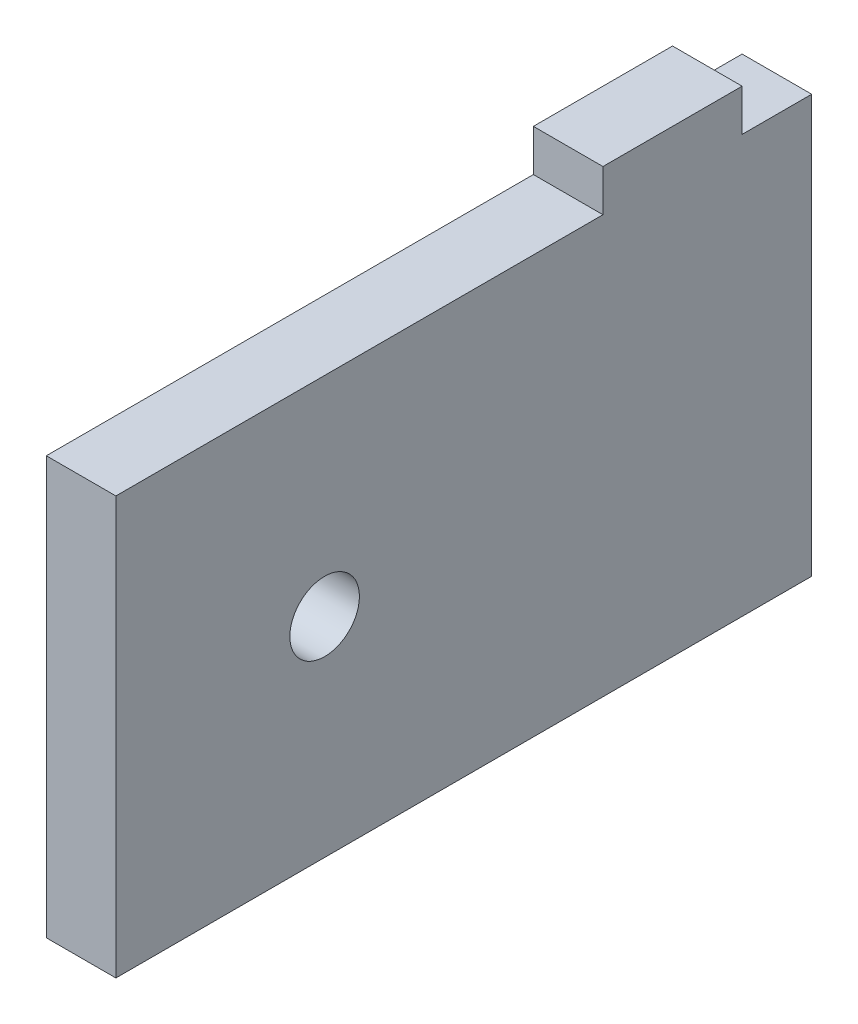
ISO-10303-21;
HEADER;
FILE_DESCRIPTION(('STEP AP214'),'2;1');
FILE_NAME('part.step','',(''),(''),'','','');
FILE_SCHEMA(('AUTOMOTIVE_DESIGN { 1 0 10303 214 1 1 1 1 }'));
ENDSEC;
DATA;
#1=APPLICATION_CONTEXT('core data for automotive mechanical design processes');
#2=APPLICATION_PROTOCOL_DEFINITION('international standard','automotive_design',2000,#1);
#3=PRODUCT_CONTEXT('',#1,'mechanical');
#4=PRODUCT('Part','Part','',(#3));
#5=PRODUCT_RELATED_PRODUCT_CATEGORY('part','',(#4));
#6=PRODUCT_DEFINITION_FORMATION('','',#4);
#7=PRODUCT_DEFINITION_CONTEXT('part definition',#1,'design');
#8=PRODUCT_DEFINITION('design','',#6,#7);
#9=PRODUCT_DEFINITION_SHAPE('','',#8);
#10=(LENGTH_UNIT() NAMED_UNIT(*) SI_UNIT(.MILLI.,.METRE.));
#11=(NAMED_UNIT(*) PLANE_ANGLE_UNIT() SI_UNIT($,.RADIAN.));
#12=(NAMED_UNIT(*) SI_UNIT($,.STERADIAN.) SOLID_ANGLE_UNIT());
#13=UNCERTAINTY_MEASURE_WITH_UNIT(LENGTH_MEASURE(1.E-05),#10,'distance_accuracy_value','');
#14=(GEOMETRIC_REPRESENTATION_CONTEXT(3) GLOBAL_UNCERTAINTY_ASSIGNED_CONTEXT((#13)) GLOBAL_UNIT_ASSIGNED_CONTEXT((#10,
#11,#12)) REPRESENTATION_CONTEXT('',''));
#15=CARTESIAN_POINT('',(0.,0.,0.));
#16=DIRECTION('',(0.,0.,1.));
#17=DIRECTION('',(1.,0.,0.));
#18=AXIS2_PLACEMENT_3D('',#15,#16,#17);
#19=CARTESIAN_POINT('',(5.,15.,25.));
#20=DIRECTION('',(0.,-1.,0.));
#21=DIRECTION('',(0.,0.,-1.));
#22=AXIS2_PLACEMENT_3D('',#19,#20,#21);
#23=PLANE('',#22);
#24=DIRECTION('',(1.,0.,0.));
#25=VECTOR('',#24,1.);
#26=CARTESIAN_POINT('',(-10.4403065089106,15.,-10.));
#27=LINE('',#26,#25);
#28=CARTESIAN_POINT('',(0.,15.,-10.));
#29=VERTEX_POINT('',#28);
#30=CARTESIAN_POINT('',(5.,15.,-10.));
#31=VERTEX_POINT('',#30);
#32=EDGE_CURVE('E118',#29,#31,#27,.T.);
#33=ORIENTED_EDGE('',*,*,#32,.F.);
#34=DIRECTION('',(0.,0.,1.));
#35=VECTOR('',#34,1.);
#36=CARTESIAN_POINT('',(0.,15.,25.));
#37=LINE('',#36,#35);
#38=CARTESIAN_POINT('',(0.,15.,25.));
#39=VERTEX_POINT('',#38);
#40=EDGE_CURVE('E115',#29,#39,#37,.T.);
#41=ORIENTED_EDGE('',*,*,#40,.T.);
#42=DIRECTION('',(-1.,0.,0.));
#43=VECTOR('',#42,1.);
#44=CARTESIAN_POINT('',(5.,15.,25.));
#45=LINE('',#44,#43);
#46=CARTESIAN_POINT('',(5.,15.,25.));
#47=VERTEX_POINT('',#46);
#48=EDGE_CURVE('E40',#47,#39,#45,.T.);
#49=ORIENTED_EDGE('',*,*,#48,.F.);
#50=DIRECTION('',(0.,0.,1.));
#51=VECTOR('',#50,1.);
#52=CARTESIAN_POINT('',(5.,15.,25.));
#53=LINE('',#52,#51);
#54=EDGE_CURVE('E157',#31,#47,#53,.T.);
#55=ORIENTED_EDGE('',*,*,#54,.F.);
#56=EDGE_LOOP('',(#33,#41,#49,#55));
#57=FACE_BOUND('',#56,.T.);
#58=ADVANCED_FACE('F31',(#57),#23,.F.);
#59=CARTESIAN_POINT('',(5.,-15.,-25.));
#60=DIRECTION('',(0.,0.,1.));
#61=DIRECTION('',(1.,0.,0.));
#62=AXIS2_PLACEMENT_3D('',#59,#60,#61);
#63=PLANE('',#62);
#64=DIRECTION('',(0.,1.,0.));
#65=VECTOR('',#64,1.);
#66=CARTESIAN_POINT('',(0.,-15.,-25.));
#67=LINE('',#66,#65);
#68=CARTESIAN_POINT('',(0.,-15.,-25.));
#69=VERTEX_POINT('',#68);
#70=CARTESIAN_POINT('',(0.,15.,-25.));
#71=VERTEX_POINT('',#70);
#72=EDGE_CURVE('E175',#69,#71,#67,.T.);
#73=ORIENTED_EDGE('',*,*,#72,.T.);
#74=DIRECTION('',(-1.,0.,0.));
#75=VECTOR('',#74,1.);
#76=CARTESIAN_POINT('',(5.,15.,-25.));
#77=LINE('',#76,#75);
#78=CARTESIAN_POINT('',(5.,15.,-25.));
#79=VERTEX_POINT('',#78);
#80=EDGE_CURVE('E11',#79,#71,#77,.T.);
#81=ORIENTED_EDGE('',*,*,#80,.F.);
#82=DIRECTION('',(0.,1.,0.));
#83=VECTOR('',#82,1.);
#84=CARTESIAN_POINT('',(5.,-15.,-25.));
#85=LINE('',#84,#83);
#86=CARTESIAN_POINT('',(5.,-15.,-25.));
#87=VERTEX_POINT('',#86);
#88=EDGE_CURVE('E161',#87,#79,#85,.T.);
#89=ORIENTED_EDGE('',*,*,#88,.F.);
#90=DIRECTION('',(-1.,0.,0.));
#91=VECTOR('',#90,1.);
#92=CARTESIAN_POINT('',(5.,-15.,-25.));
#93=LINE('',#92,#91);
#94=EDGE_CURVE('E174',#87,#69,#93,.T.);
#95=ORIENTED_EDGE('',*,*,#94,.T.);
#96=EDGE_LOOP('',(#73,#81,#89,#95));
#97=FACE_BOUND('',#96,.T.);
#98=ADVANCED_FACE('F33',(#97),#63,.F.);
#99=CARTESIAN_POINT('',(0.,15.,-20.));
#100=VERTEX_POINT('',#99);
#101=EDGE_CURVE('E184',#71,#100,#37,.T.);
#102=ORIENTED_EDGE('',*,*,#101,.T.);
#103=DIRECTION('',(1.,0.,0.));
#104=VECTOR('',#103,1.);
#105=CARTESIAN_POINT('',(-10.4403065089106,15.,-20.));
#106=LINE('',#105,#104);
#107=CARTESIAN_POINT('',(5.,15.,-20.));
#108=VERTEX_POINT('',#107);
#109=EDGE_CURVE('E142',#100,#108,#106,.T.);
#110=ORIENTED_EDGE('',*,*,#109,.T.);
#111=EDGE_CURVE('E84',#79,#108,#53,.T.);
#112=ORIENTED_EDGE('',*,*,#111,.F.);
#113=ORIENTED_EDGE('',*,*,#80,.T.);
#114=EDGE_LOOP('',(#102,#110,#112,#113));
#115=FACE_BOUND('',#114,.T.);
#116=ADVANCED_FACE('F217',(#115),#23,.F.);
#117=CARTESIAN_POINT('',(5.,-15.,25.));
#118=DIRECTION('',(0.,0.,-1.));
#119=DIRECTION('',(-1.,0.,0.));
#120=AXIS2_PLACEMENT_3D('',#117,#118,#119);
#121=PLANE('',#120);
#122=DIRECTION('',(0.,-1.,0.));
#123=VECTOR('',#122,1.);
#124=CARTESIAN_POINT('',(0.,-15.,25.));
#125=LINE('',#124,#123);
#126=CARTESIAN_POINT('',(0.,-15.,25.));
#127=VERTEX_POINT('',#126);
#128=EDGE_CURVE('E180',#39,#127,#125,.T.);
#129=ORIENTED_EDGE('',*,*,#128,.T.);
#130=DIRECTION('',(-1.,0.,0.));
#131=VECTOR('',#130,1.);
#132=CARTESIAN_POINT('',(5.,-15.,25.));
#133=LINE('',#132,#131);
#134=CARTESIAN_POINT('',(5.,-15.,25.));
#135=VERTEX_POINT('',#134);
#136=EDGE_CURVE('E188',#135,#127,#133,.T.);
#137=ORIENTED_EDGE('',*,*,#136,.F.);
#138=DIRECTION('',(0.,-1.,0.));
#139=VECTOR('',#138,1.);
#140=CARTESIAN_POINT('',(5.,-15.,25.));
#141=LINE('',#140,#139);
#142=EDGE_CURVE('E163',#47,#135,#141,.T.);
#143=ORIENTED_EDGE('',*,*,#142,.F.);
#144=ORIENTED_EDGE('',*,*,#48,.T.);
#145=EDGE_LOOP('',(#129,#137,#143,#144));
#146=FACE_BOUND('',#145,.T.);
#147=ADVANCED_FACE('F192',(#146),#121,.F.);
#148=CARTESIAN_POINT('',(5.,-15.,25.));
#149=DIRECTION('',(0.,1.,0.));
#150=DIRECTION('',(0.,0.,1.));
#151=AXIS2_PLACEMENT_3D('',#148,#149,#150);
#152=PLANE('',#151);
#153=DIRECTION('',(0.,0.,-1.));
#154=VECTOR('',#153,1.);
#155=CARTESIAN_POINT('',(0.,-15.,25.));
#156=LINE('',#155,#154);
#157=EDGE_CURVE('E78',#127,#69,#156,.T.);
#158=ORIENTED_EDGE('',*,*,#157,.T.);
#159=ORIENTED_EDGE('',*,*,#94,.F.);
#160=DIRECTION('',(0.,0.,-1.));
#161=VECTOR('',#160,1.);
#162=CARTESIAN_POINT('',(5.,-15.,25.));
#163=LINE('',#162,#161);
#164=EDGE_CURVE('E57',#135,#87,#163,.T.);
#165=ORIENTED_EDGE('',*,*,#164,.F.);
#166=ORIENTED_EDGE('',*,*,#136,.T.);
#167=EDGE_LOOP('',(#158,#159,#165,#166));
#168=FACE_BOUND('',#167,.T.);
#169=ADVANCED_FACE('F193',(#168),#152,.F.);
#170=CARTESIAN_POINT('',(5.,15.,-25.));
#171=DIRECTION('',(-1.,0.,0.));
#172=DIRECTION('',(0.,0.,1.));
#173=AXIS2_PLACEMENT_3D('',#170,#171,#172);
#174=PLANE('',#173);
#175=CARTESIAN_POINT('',(5.,0.,10.));
#176=DIRECTION('',(1.,0.,0.));
#177=DIRECTION('',(0.,0.,-1.));
#178=AXIS2_PLACEMENT_3D('',#175,#176,#177);
#179=CIRCLE('',#178,2.5);
#180=CARTESIAN_POINT('',(5.,0.,7.5));
#181=VERTEX_POINT('',#180);
#182=EDGE_CURVE('E198',#181,#181,#179,.T.);
#183=ORIENTED_EDGE('',*,*,#182,.F.);
#184=EDGE_LOOP('',(#183));
#185=FACE_BOUND('',#184,.T.);
#186=ORIENTED_EDGE('',*,*,#88,.T.);
#187=ORIENTED_EDGE('',*,*,#111,.T.);
#188=DIRECTION('',(0.,1.,0.));
#189=VECTOR('',#188,1.);
#190=CARTESIAN_POINT('',(5.,15.,-20.));
#191=LINE('',#190,#189);
#192=CARTESIAN_POINT('',(5.,18.,-20.));
#193=VERTEX_POINT('',#192);
#194=EDGE_CURVE('E48',#108,#193,#191,.T.);
#195=ORIENTED_EDGE('',*,*,#194,.T.);
#196=DIRECTION('',(0.,0.,1.));
#197=VECTOR('',#196,1.);
#198=CARTESIAN_POINT('',(5.,18.,-20.));
#199=LINE('',#198,#197);
#200=CARTESIAN_POINT('',(5.,18.,-10.));
#201=VERTEX_POINT('',#200);
#202=EDGE_CURVE('E133',#193,#201,#199,.T.);
#203=ORIENTED_EDGE('',*,*,#202,.T.);
#204=DIRECTION('',(0.,-1.,0.));
#205=VECTOR('',#204,1.);
#206=CARTESIAN_POINT('',(5.,15.,-10.));
#207=LINE('',#206,#205);
#208=EDGE_CURVE('E124',#201,#31,#207,.T.);
#209=ORIENTED_EDGE('',*,*,#208,.T.);
#210=ORIENTED_EDGE('',*,*,#54,.T.);
#211=ORIENTED_EDGE('',*,*,#142,.T.);
#212=ORIENTED_EDGE('',*,*,#164,.T.);
#213=EDGE_LOOP('',(#186,#187,#195,#203,#209,#210,#211,#212));
#214=FACE_BOUND('',#213,.T.);
#215=ADVANCED_FACE('F156',(#185,#214),#174,.F.);
#216=CARTESIAN_POINT('',(0.,15.,-25.));
#217=DIRECTION('',(-1.,0.,0.));
#218=DIRECTION('',(0.,0.,1.));
#219=AXIS2_PLACEMENT_3D('',#216,#217,#218);
#220=PLANE('',#219);
#221=CARTESIAN_POINT('',(0.,0.,10.));
#222=DIRECTION('',(-1.,0.,0.));
#223=DIRECTION('',(0.,0.,1.));
#224=AXIS2_PLACEMENT_3D('',#221,#222,#223);
#225=CIRCLE('',#224,2.5);
#226=CARTESIAN_POINT('',(0.,0.,12.5));
#227=VERTEX_POINT('',#226);
#228=EDGE_CURVE('E35',#227,#227,#225,.T.);
#229=ORIENTED_EDGE('',*,*,#228,.F.);
#230=EDGE_LOOP('',(#229));
#231=FACE_BOUND('',#230,.T.);
#232=ORIENTED_EDGE('',*,*,#72,.F.);
#233=ORIENTED_EDGE('',*,*,#157,.F.);
#234=ORIENTED_EDGE('',*,*,#128,.F.);
#235=ORIENTED_EDGE('',*,*,#40,.F.);
#236=DIRECTION('',(0.,-1.,0.));
#237=VECTOR('',#236,1.);
#238=CARTESIAN_POINT('',(0.,15.,-10.));
#239=LINE('',#238,#237);
#240=CARTESIAN_POINT('',(0.,18.,-10.));
#241=VERTEX_POINT('',#240);
#242=EDGE_CURVE('E107',#241,#29,#239,.T.);
#243=ORIENTED_EDGE('',*,*,#242,.F.);
#244=DIRECTION('',(0.,0.,1.));
#245=VECTOR('',#244,1.);
#246=CARTESIAN_POINT('',(0.,18.,-20.));
#247=LINE('',#246,#245);
#248=CARTESIAN_POINT('',(0.,18.,-20.));
#249=VERTEX_POINT('',#248);
#250=EDGE_CURVE('E112',#249,#241,#247,.T.);
#251=ORIENTED_EDGE('',*,*,#250,.F.);
#252=DIRECTION('',(0.,1.,0.));
#253=VECTOR('',#252,1.);
#254=CARTESIAN_POINT('',(0.,15.,-20.));
#255=LINE('',#254,#253);
#256=EDGE_CURVE('E145',#100,#249,#255,.T.);
#257=ORIENTED_EDGE('',*,*,#256,.F.);
#258=ORIENTED_EDGE('',*,*,#101,.F.);
#259=EDGE_LOOP('',(#232,#233,#234,#235,#243,#251,#257,#258));
#260=FACE_BOUND('',#259,.T.);
#261=ADVANCED_FACE('F110',(#231,#260),#220,.T.);
#262=CARTESIAN_POINT('',(-10.4403065089106,18.,-20.));
#263=DIRECTION('',(0.,1.,0.));
#264=DIRECTION('',(0.,0.,1.));
#265=AXIS2_PLACEMENT_3D('',#262,#263,#264);
#266=PLANE('',#265);
#267=DIRECTION('',(1.,0.,0.));
#268=VECTOR('',#267,1.);
#269=CARTESIAN_POINT('',(-10.4403065089106,18.,-20.));
#270=LINE('',#269,#268);
#271=EDGE_CURVE('E131',#249,#193,#270,.T.);
#272=ORIENTED_EDGE('',*,*,#271,.F.);
#273=ORIENTED_EDGE('',*,*,#250,.T.);
#274=DIRECTION('',(1.,0.,0.));
#275=VECTOR('',#274,1.);
#276=CARTESIAN_POINT('',(-10.4403065089106,18.,-10.));
#277=LINE('',#276,#275);
#278=EDGE_CURVE('E119',#241,#201,#277,.T.);
#279=ORIENTED_EDGE('',*,*,#278,.T.);
#280=ORIENTED_EDGE('',*,*,#202,.F.);
#281=EDGE_LOOP('',(#272,#273,#279,#280));
#282=FACE_BOUND('',#281,.T.);
#283=ADVANCED_FACE('F130',(#282),#266,.T.);
#284=CARTESIAN_POINT('',(-10.4403065089106,15.,-10.));
#285=DIRECTION('',(0.,0.,1.));
#286=DIRECTION('',(0.,-1.,0.));
#287=AXIS2_PLACEMENT_3D('',#284,#285,#286);
#288=PLANE('',#287);
#289=ORIENTED_EDGE('',*,*,#278,.F.);
#290=ORIENTED_EDGE('',*,*,#242,.T.);
#291=ORIENTED_EDGE('',*,*,#32,.T.);
#292=ORIENTED_EDGE('',*,*,#208,.F.);
#293=EDGE_LOOP('',(#289,#290,#291,#292));
#294=FACE_BOUND('',#293,.T.);
#295=ADVANCED_FACE('F122',(#294),#288,.T.);
#296=CARTESIAN_POINT('',(-10.4403065089106,15.,-20.));
#297=DIRECTION('',(0.,0.,-1.));
#298=DIRECTION('',(-1.,0.,0.));
#299=AXIS2_PLACEMENT_3D('',#296,#297,#298);
#300=PLANE('',#299);
#301=ORIENTED_EDGE('',*,*,#109,.F.);
#302=ORIENTED_EDGE('',*,*,#256,.T.);
#303=ORIENTED_EDGE('',*,*,#271,.T.);
#304=ORIENTED_EDGE('',*,*,#194,.F.);
#305=EDGE_LOOP('',(#301,#302,#303,#304));
#306=FACE_BOUND('',#305,.T.);
#307=ADVANCED_FACE('F226',(#306),#300,.T.);
#308=CARTESIAN_POINT('',(-4.99999999997031E-05,0.,10.));
#309=DIRECTION('',(1.,0.,0.));
#310=DIRECTION('',(0.,0.,-1.));
#311=AXIS2_PLACEMENT_3D('',#308,#309,#310);
#312=CYLINDRICAL_SURFACE('',#311,2.5);
#313=ORIENTED_EDGE('',*,*,#228,.T.);
#314=EDGE_LOOP('',(#313));
#315=FACE_BOUND('',#314,.T.);
#316=ORIENTED_EDGE('',*,*,#182,.T.);
#317=EDGE_LOOP('',(#316));
#318=FACE_BOUND('',#317,.T.);
#319=ADVANCED_FACE('F204',(#315,#318),#312,.F.);
#320=CLOSED_SHELL('',(#58,#98,#116,#147,#169,#215,#261,#283,#295,#307,#319));
#321=MANIFOLD_SOLID_BREP('B2',#320);
#322=ADVANCED_BREP_SHAPE_REPRESENTATION('',(#18,#321),#14);
#323=SHAPE_DEFINITION_REPRESENTATION(#9,#322);
ENDSEC;
END-ISO-10303-21;
